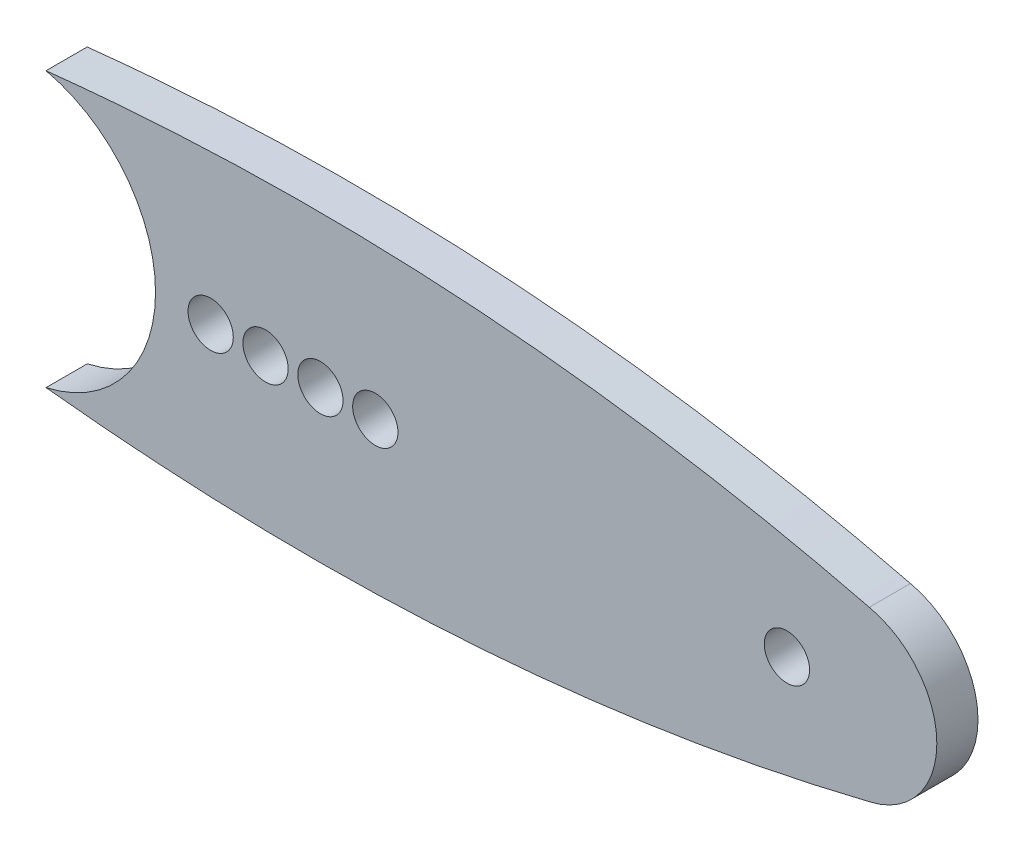
ISO-10303-21;
HEADER;
FILE_DESCRIPTION(('STEP AP214'),'2;1');
FILE_NAME('part.step','',(''),(''),'','','');
FILE_SCHEMA(('AUTOMOTIVE_DESIGN { 1 0 10303 214 1 1 1 1 }'));
ENDSEC;
DATA;
#1=APPLICATION_CONTEXT('core data for automotive mechanical design processes');
#2=APPLICATION_PROTOCOL_DEFINITION('international standard','automotive_design',2000,#1);
#3=PRODUCT_CONTEXT('',#1,'mechanical');
#4=PRODUCT('Part','Part','',(#3));
#5=PRODUCT_RELATED_PRODUCT_CATEGORY('part','',(#4));
#6=PRODUCT_DEFINITION_FORMATION('','',#4);
#7=PRODUCT_DEFINITION_CONTEXT('part definition',#1,'design');
#8=PRODUCT_DEFINITION('design','',#6,#7);
#9=PRODUCT_DEFINITION_SHAPE('','',#8);
#10=(LENGTH_UNIT() NAMED_UNIT(*) SI_UNIT(.MILLI.,.METRE.));
#11=(NAMED_UNIT(*) PLANE_ANGLE_UNIT() SI_UNIT($,.RADIAN.));
#12=(NAMED_UNIT(*) SI_UNIT($,.STERADIAN.) SOLID_ANGLE_UNIT());
#13=UNCERTAINTY_MEASURE_WITH_UNIT(LENGTH_MEASURE(1.E-05),#10,'distance_accuracy_value','');
#14=(GEOMETRIC_REPRESENTATION_CONTEXT(3) GLOBAL_UNCERTAINTY_ASSIGNED_CONTEXT((#13)) GLOBAL_UNIT_ASSIGNED_CONTEXT((#10,
#11,#12)) REPRESENTATION_CONTEXT('',''));
#15=CARTESIAN_POINT('',(0.,0.,0.));
#16=DIRECTION('',(0.,0.,1.));
#17=DIRECTION('',(1.,0.,0.));
#18=AXIS2_PLACEMENT_3D('',#15,#16,#17);
#19=CARTESIAN_POINT('',(30.4462397626462,10.7025311532782,0.));
#20=DIRECTION('',(0.,0.,1.));
#21=DIRECTION('',(1.,0.,0.));
#22=AXIS2_PLACEMENT_3D('',#19,#20,#21);
#23=PLANE('',#22);
#24=CARTESIAN_POINT('',(54.,0.,0.));
#25=DIRECTION('',(0.,0.,1.));
#26=DIRECTION('',(1.,0.,0.));
#27=AXIS2_PLACEMENT_3D('',#24,#25,#26);
#28=CIRCLE('',#27,1.65);
#29=CARTESIAN_POINT('',(55.65,0.,0.));
#30=VERTEX_POINT('',#29);
#31=EDGE_CURVE('E126',#30,#30,#28,.T.);
#32=ORIENTED_EDGE('',*,*,#31,.T.);
#33=EDGE_LOOP('',(#32));
#34=FACE_BOUND('',#33,.T.);
#35=CARTESIAN_POINT('',(24.,0.,0.));
#36=DIRECTION('',(0.,0.,1.));
#37=DIRECTION('',(1.,0.,0.));
#38=AXIS2_PLACEMENT_3D('',#35,#36,#37);
#39=CIRCLE('',#38,1.65);
#40=CARTESIAN_POINT('',(25.65,0.,0.));
#41=VERTEX_POINT('',#40);
#42=EDGE_CURVE('E136',#41,#41,#39,.T.);
#43=ORIENTED_EDGE('',*,*,#42,.T.);
#44=EDGE_LOOP('',(#43));
#45=FACE_BOUND('',#44,.T.);
#46=CARTESIAN_POINT('',(12.,0.,0.));
#47=DIRECTION('',(0.,0.,1.));
#48=DIRECTION('',(1.,0.,0.));
#49=AXIS2_PLACEMENT_3D('',#46,#47,#48);
#50=CIRCLE('',#49,1.65);
#51=CARTESIAN_POINT('',(13.65,0.,0.));
#52=VERTEX_POINT('',#51);
#53=EDGE_CURVE('E141',#52,#52,#50,.T.);
#54=ORIENTED_EDGE('',*,*,#53,.T.);
#55=EDGE_LOOP('',(#54));
#56=FACE_BOUND('',#55,.T.);
#57=CARTESIAN_POINT('',(20.,0.,0.));
#58=DIRECTION('',(0.,0.,1.));
#59=DIRECTION('',(1.,0.,0.));
#60=AXIS2_PLACEMENT_3D('',#57,#58,#59);
#61=CIRCLE('',#60,1.65);
#62=CARTESIAN_POINT('',(21.65,0.,0.));
#63=VERTEX_POINT('',#62);
#64=EDGE_CURVE('E147',#63,#63,#61,.T.);
#65=ORIENTED_EDGE('',*,*,#64,.T.);
#66=EDGE_LOOP('',(#65));
#67=FACE_BOUND('',#66,.T.);
#68=CARTESIAN_POINT('',(16.,0.,0.));
#69=DIRECTION('',(0.,0.,1.));
#70=DIRECTION('',(1.,0.,0.));
#71=AXIS2_PLACEMENT_3D('',#68,#69,#70);
#72=CIRCLE('',#71,1.65);
#73=CARTESIAN_POINT('',(17.65,0.,0.));
#74=VERTEX_POINT('',#73);
#75=EDGE_CURVE('E153',#74,#74,#72,.T.);
#76=ORIENTED_EDGE('',*,*,#75,.T.);
#77=EDGE_LOOP('',(#76));
#78=FACE_BOUND('',#77,.T.);
#79=CARTESIAN_POINT('',(60.,6.13600538206782,0.));
#80=CARTESIAN_POINT('',(30.8924795252925,13.3370596155225,0.));
#81=CARTESIAN_POINT('',(0.,10.,0.));
#82=B_SPLINE_CURVE_WITH_KNOTS('',2,(#79,#80,#81),.UNSPECIFIED.,.F.,.F.,(3,3),(0.,
0.860506177174016),.UNSPECIFIED.);
#83=CARTESIAN_POINT('',(60.,6.13600538206782,0.));
#84=VERTEX_POINT('',#83);
#85=CARTESIAN_POINT('',(0.,10.,0.));
#86=VERTEX_POINT('',#85);
#87=EDGE_CURVE('E159',#84,#86,#82,.T.);
#88=ORIENTED_EDGE('',*,*,#87,.F.);
#89=CARTESIAN_POINT('',(58.6400237608325,0.,0.));
#90=DIRECTION('',(0.,0.,1.));
#91=DIRECTION('',(-1.,0.,0.));
#92=AXIS2_PLACEMENT_3D('',#89,#90,#91);
#93=CIRCLE('',#92,6.28491029529185);
#94=CARTESIAN_POINT('',(60.,-6.13600538206782,0.));
#95=VERTEX_POINT('',#94);
#96=EDGE_CURVE('E168',#95,#84,#93,.T.);
#97=ORIENTED_EDGE('',*,*,#96,.F.);
#98=CARTESIAN_POINT('',(0.,-10.,0.));
#99=CARTESIAN_POINT('',(30.8924795252925,-13.3370596155225,0.));
#100=CARTESIAN_POINT('',(60.,-6.13600538206782,0.));
#101=B_SPLINE_CURVE_WITH_KNOTS('',2,(#98,#99,#100),.UNSPECIFIED.,.F.,.F.,(3,3),(0.,
0.860506177174016),.UNSPECIFIED.);
#102=CARTESIAN_POINT('',(0.,-10.,0.));
#103=VERTEX_POINT('',#102);
#104=EDGE_CURVE('E342',#103,#95,#101,.T.);
#105=ORIENTED_EDGE('',*,*,#104,.F.);
#106=CARTESIAN_POINT('',(-2.2729782475424,0.,0.));
#107=DIRECTION('',(0.,0.,-1.));
#108=DIRECTION('',(-1.,0.,0.));
#109=AXIS2_PLACEMENT_3D('',#106,#107,#108);
#110=CIRCLE('',#109,10.2550685084889);
#111=EDGE_CURVE('E347',#86,#103,#110,.T.);
#112=ORIENTED_EDGE('',*,*,#111,.F.);
#113=EDGE_LOOP('',(#88,#97,#105,#112));
#114=FACE_BOUND('',#113,.T.);
#115=DIRECTION('',(0.,1.,0.));
#116=VECTOR('',#115,1.);
#117=CARTESIAN_POINT('',(29.2337483410634,-1.76319229390439,0.));
#118=LINE('',#117,#116);
#119=CARTESIAN_POINT('',(29.2337483410634,-1.76319229390439,0.));
#120=VERTEX_POINT('',#119);
#121=CARTESIAN_POINT('',(29.2337483410634,1.76319229390438,0.));
#122=VERTEX_POINT('',#121);
#123=EDGE_CURVE('E125',#120,#122,#118,.T.);
#124=ORIENTED_EDGE('',*,*,#123,.F.);
#125=DIRECTION('',(-1.,0.,0.));
#126=VECTOR('',#125,1.);
#127=CARTESIAN_POINT('',(49.2337483410634,-1.76319229390439,0.));
#128=LINE('',#127,#126);
#129=CARTESIAN_POINT('',(49.2337483410634,-1.76319229390439,0.));
#130=VERTEX_POINT('',#129);
#131=EDGE_CURVE('E122',#130,#120,#128,.T.);
#132=ORIENTED_EDGE('',*,*,#131,.F.);
#133=DIRECTION('',(0.,-1.,0.));
#134=VECTOR('',#133,1.);
#135=CARTESIAN_POINT('',(49.2337483410634,-1.76319229390439,0.));
#136=LINE('',#135,#134);
#137=CARTESIAN_POINT('',(49.2337483410634,1.76319229390438,0.));
#138=VERTEX_POINT('',#137);
#139=EDGE_CURVE('E60',#138,#130,#136,.T.);
#140=ORIENTED_EDGE('',*,*,#139,.F.);
#141=DIRECTION('',(1.,0.,0.));
#142=VECTOR('',#141,1.);
#143=CARTESIAN_POINT('',(49.2337483410634,1.76319229390438,0.));
#144=LINE('',#143,#142);
#145=EDGE_CURVE('E55',#122,#138,#144,.T.);
#146=ORIENTED_EDGE('',*,*,#145,.F.);
#147=EDGE_LOOP('',(#124,#132,#140,#146));
#148=FACE_BOUND('',#147,.T.);
#149=ADVANCED_FACE('F39',(#34,#45,#56,#67,#78,#114,#148),#23,.F.);
#150=CARTESIAN_POINT('',(30.4462397626462,10.7025311532782,3.));
#151=DIRECTION('',(0.,0.,1.));
#152=DIRECTION('',(1.,0.,0.));
#153=AXIS2_PLACEMENT_3D('',#150,#151,#152);
#154=PLANE('',#153);
#155=CARTESIAN_POINT('',(24.,0.,3.));
#156=DIRECTION('',(0.,0.,1.));
#157=DIRECTION('',(1.,0.,0.));
#158=AXIS2_PLACEMENT_3D('',#155,#156,#157);
#159=CIRCLE('',#158,1.65);
#160=CARTESIAN_POINT('',(25.65,0.,3.));
#161=VERTEX_POINT('',#160);
#162=EDGE_CURVE('E138',#161,#161,#159,.T.);
#163=ORIENTED_EDGE('',*,*,#162,.F.);
#164=EDGE_LOOP('',(#163));
#165=FACE_BOUND('',#164,.T.);
#166=CARTESIAN_POINT('',(20.,0.,3.));
#167=DIRECTION('',(0.,0.,1.));
#168=DIRECTION('',(1.,0.,0.));
#169=AXIS2_PLACEMENT_3D('',#166,#167,#168);
#170=CIRCLE('',#169,1.65);
#171=CARTESIAN_POINT('',(21.65,0.,3.));
#172=VERTEX_POINT('',#171);
#173=EDGE_CURVE('E150',#172,#172,#170,.T.);
#174=ORIENTED_EDGE('',*,*,#173,.F.);
#175=EDGE_LOOP('',(#174));
#176=FACE_BOUND('',#175,.T.);
#177=CARTESIAN_POINT('',(60.,6.13600538206782,3.));
#178=CARTESIAN_POINT('',(30.8924795252925,13.3370596155225,3.));
#179=CARTESIAN_POINT('',(0.,10.,3.));
#180=B_SPLINE_CURVE_WITH_KNOTS('',2,(#177,#178,#179),.UNSPECIFIED.,.F.,.F.,(3,3),(0.,
0.860506177174016),.UNSPECIFIED.);
#181=CARTESIAN_POINT('',(60.,6.13600538206782,3.));
#182=VERTEX_POINT('',#181);
#183=CARTESIAN_POINT('',(0.,10.,3.));
#184=VERTEX_POINT('',#183);
#185=EDGE_CURVE('E161',#182,#184,#180,.T.);
#186=ORIENTED_EDGE('',*,*,#185,.T.);
#187=CARTESIAN_POINT('',(-2.2729782475424,0.,3.));
#188=DIRECTION('',(0.,0.,-1.));
#189=DIRECTION('',(-1.,0.,0.));
#190=AXIS2_PLACEMENT_3D('',#187,#188,#189);
#191=CIRCLE('',#190,10.2550685084889);
#192=CARTESIAN_POINT('',(0.,-10.,3.));
#193=VERTEX_POINT('',#192);
#194=EDGE_CURVE('E167',#184,#193,#191,.T.);
#195=ORIENTED_EDGE('',*,*,#194,.T.);
#196=CARTESIAN_POINT('',(0.,-10.,3.));
#197=CARTESIAN_POINT('',(30.8924795252925,-13.3370596155225,3.));
#198=CARTESIAN_POINT('',(60.,-6.13600538206782,3.));
#199=B_SPLINE_CURVE_WITH_KNOTS('',2,(#196,#197,#198),.UNSPECIFIED.,.F.,.F.,(3,3),(0.,
0.860506177174016),.UNSPECIFIED.);
#200=CARTESIAN_POINT('',(60.,-6.13600538206782,3.));
#201=VERTEX_POINT('',#200);
#202=EDGE_CURVE('E173',#193,#201,#199,.T.);
#203=ORIENTED_EDGE('',*,*,#202,.T.);
#204=CARTESIAN_POINT('',(58.6400237608325,0.,3.));
#205=DIRECTION('',(0.,0.,1.));
#206=DIRECTION('',(-1.,0.,0.));
#207=AXIS2_PLACEMENT_3D('',#204,#205,#206);
#208=CIRCLE('',#207,6.28491029529185);
#209=EDGE_CURVE('E178',#201,#182,#208,.T.);
#210=ORIENTED_EDGE('',*,*,#209,.T.);
#211=EDGE_LOOP('',(#186,#195,#203,#210));
#212=FACE_BOUND('',#211,.T.);
#213=CARTESIAN_POINT('',(16.,0.,3.));
#214=DIRECTION('',(0.,0.,1.));
#215=DIRECTION('',(1.,0.,0.));
#216=AXIS2_PLACEMENT_3D('',#213,#214,#215);
#217=CIRCLE('',#216,1.65);
#218=CARTESIAN_POINT('',(17.65,0.,3.));
#219=VERTEX_POINT('',#218);
#220=EDGE_CURVE('E156',#219,#219,#217,.T.);
#221=ORIENTED_EDGE('',*,*,#220,.F.);
#222=EDGE_LOOP('',(#221));
#223=FACE_BOUND('',#222,.T.);
#224=CARTESIAN_POINT('',(12.,0.,3.));
#225=DIRECTION('',(0.,0.,1.));
#226=DIRECTION('',(1.,0.,0.));
#227=AXIS2_PLACEMENT_3D('',#224,#225,#226);
#228=CIRCLE('',#227,1.65);
#229=CARTESIAN_POINT('',(13.65,0.,3.));
#230=VERTEX_POINT('',#229);
#231=EDGE_CURVE('E144',#230,#230,#228,.T.);
#232=ORIENTED_EDGE('',*,*,#231,.F.);
#233=EDGE_LOOP('',(#232));
#234=FACE_BOUND('',#233,.T.);
#235=CARTESIAN_POINT('',(54.,0.,3.));
#236=DIRECTION('',(0.,0.,1.));
#237=DIRECTION('',(1.,0.,0.));
#238=AXIS2_PLACEMENT_3D('',#235,#236,#237);
#239=CIRCLE('',#238,1.65);
#240=CARTESIAN_POINT('',(55.65,0.,3.));
#241=VERTEX_POINT('',#240);
#242=EDGE_CURVE('E129',#241,#241,#239,.T.);
#243=ORIENTED_EDGE('',*,*,#242,.F.);
#244=EDGE_LOOP('',(#243));
#245=FACE_BOUND('',#244,.T.);
#246=ADVANCED_FACE('F196',(#165,#176,#212,#223,#234,#245),#154,.T.);
#247=DIRECTION('',(0.,0.,-1.));
#248=VECTOR('',#247,1.);
#249=SURFACE_OF_LINEAR_EXTRUSION('',#180,#248);
#250=ORIENTED_EDGE('',*,*,#87,.T.);
#251=DIRECTION('',(0.,0.,-1.));
#252=VECTOR('',#251,1.);
#253=CARTESIAN_POINT('',(0.,10.,3.));
#254=LINE('',#253,#252);
#255=EDGE_CURVE('E11',#184,#86,#254,.T.);
#256=ORIENTED_EDGE('',*,*,#255,.F.);
#257=ORIENTED_EDGE('',*,*,#185,.F.);
#258=DIRECTION('',(0.,0.,-1.));
#259=VECTOR('',#258,1.);
#260=CARTESIAN_POINT('',(60.,6.13600538206782,3.));
#261=LINE('',#260,#259);
#262=EDGE_CURVE('E335',#182,#84,#261,.T.);
#263=ORIENTED_EDGE('',*,*,#262,.T.);
#264=EDGE_LOOP('',(#250,#256,#257,#263));
#265=FACE_BOUND('',#264,.T.);
#266=ADVANCED_FACE('F41',(#265),#249,.F.);
#267=CARTESIAN_POINT('',(-2.2729782475424,0.,3.));
#268=DIRECTION('',(0.,0.,-1.));
#269=DIRECTION('',(-1.,0.,0.));
#270=AXIS2_PLACEMENT_3D('',#267,#268,#269);
#271=CYLINDRICAL_SURFACE('',#270,10.2550685084889);
#272=ORIENTED_EDGE('',*,*,#111,.T.);
#273=DIRECTION('',(0.,0.,-1.));
#274=VECTOR('',#273,1.);
#275=CARTESIAN_POINT('',(0.,-10.,3.));
#276=LINE('',#275,#274);
#277=EDGE_CURVE('E48',#193,#103,#276,.T.);
#278=ORIENTED_EDGE('',*,*,#277,.F.);
#279=ORIENTED_EDGE('',*,*,#194,.F.);
#280=ORIENTED_EDGE('',*,*,#255,.T.);
#281=EDGE_LOOP('',(#272,#278,#279,#280));
#282=FACE_BOUND('',#281,.T.);
#283=ADVANCED_FACE('F188',(#282),#271,.F.);
#284=DIRECTION('',(0.,0.,-1.));
#285=VECTOR('',#284,1.);
#286=SURFACE_OF_LINEAR_EXTRUSION('',#199,#285);
#287=ORIENTED_EDGE('',*,*,#104,.T.);
#288=DIRECTION('',(0.,0.,-1.));
#289=VECTOR('',#288,1.);
#290=CARTESIAN_POINT('',(60.,-6.13600538206782,3.));
#291=LINE('',#290,#289);
#292=EDGE_CURVE('E338',#201,#95,#291,.T.);
#293=ORIENTED_EDGE('',*,*,#292,.F.);
#294=ORIENTED_EDGE('',*,*,#202,.F.);
#295=ORIENTED_EDGE('',*,*,#277,.T.);
#296=EDGE_LOOP('',(#287,#293,#294,#295));
#297=FACE_BOUND('',#296,.T.);
#298=ADVANCED_FACE('F184',(#297),#286,.F.);
#299=CARTESIAN_POINT('',(58.6400237608325,0.,3.));
#300=DIRECTION('',(0.,0.,-1.));
#301=DIRECTION('',(-1.,0.,0.));
#302=AXIS2_PLACEMENT_3D('',#299,#300,#301);
#303=CYLINDRICAL_SURFACE('',#302,6.28491029529185);
#304=ORIENTED_EDGE('',*,*,#96,.T.);
#305=ORIENTED_EDGE('',*,*,#262,.F.);
#306=ORIENTED_EDGE('',*,*,#209,.F.);
#307=ORIENTED_EDGE('',*,*,#292,.T.);
#308=EDGE_LOOP('',(#304,#305,#306,#307));
#309=FACE_BOUND('',#308,.T.);
#310=ADVANCED_FACE('F187',(#309),#303,.T.);
#311=CARTESIAN_POINT('',(16.,0.,3.));
#312=DIRECTION('',(0.,0.,-1.));
#313=DIRECTION('',(-1.,0.,0.));
#314=AXIS2_PLACEMENT_3D('',#311,#312,#313);
#315=CYLINDRICAL_SURFACE('',#314,1.65);
#316=ORIENTED_EDGE('',*,*,#220,.T.);
#317=EDGE_LOOP('',(#316));
#318=FACE_BOUND('',#317,.T.);
#319=ORIENTED_EDGE('',*,*,#75,.F.);
#320=EDGE_LOOP('',(#319));
#321=FACE_BOUND('',#320,.T.);
#322=ADVANCED_FACE('F209',(#318,#321),#315,.F.);
#323=CARTESIAN_POINT('',(20.,0.,3.));
#324=DIRECTION('',(0.,0.,-1.));
#325=DIRECTION('',(-1.,0.,0.));
#326=AXIS2_PLACEMENT_3D('',#323,#324,#325);
#327=CYLINDRICAL_SURFACE('',#326,1.65);
#328=ORIENTED_EDGE('',*,*,#173,.T.);
#329=EDGE_LOOP('',(#328));
#330=FACE_BOUND('',#329,.T.);
#331=ORIENTED_EDGE('',*,*,#64,.F.);
#332=EDGE_LOOP('',(#331));
#333=FACE_BOUND('',#332,.T.);
#334=ADVANCED_FACE('F212',(#330,#333),#327,.F.);
#335=CARTESIAN_POINT('',(12.,0.,3.));
#336=DIRECTION('',(0.,0.,-1.));
#337=DIRECTION('',(-1.,0.,0.));
#338=AXIS2_PLACEMENT_3D('',#335,#336,#337);
#339=CYLINDRICAL_SURFACE('',#338,1.65);
#340=ORIENTED_EDGE('',*,*,#231,.T.);
#341=EDGE_LOOP('',(#340));
#342=FACE_BOUND('',#341,.T.);
#343=ORIENTED_EDGE('',*,*,#53,.F.);
#344=EDGE_LOOP('',(#343));
#345=FACE_BOUND('',#344,.T.);
#346=ADVANCED_FACE('F216',(#342,#345),#339,.F.);
#347=CARTESIAN_POINT('',(24.,0.,3.));
#348=DIRECTION('',(0.,0.,-1.));
#349=DIRECTION('',(-1.,0.,0.));
#350=AXIS2_PLACEMENT_3D('',#347,#348,#349);
#351=CYLINDRICAL_SURFACE('',#350,1.65);
#352=ORIENTED_EDGE('',*,*,#162,.T.);
#353=EDGE_LOOP('',(#352));
#354=FACE_BOUND('',#353,.T.);
#355=ORIENTED_EDGE('',*,*,#42,.F.);
#356=EDGE_LOOP('',(#355));
#357=FACE_BOUND('',#356,.T.);
#358=ADVANCED_FACE('F220',(#354,#357),#351,.F.);
#359=CARTESIAN_POINT('',(54.,0.,3.));
#360=DIRECTION('',(0.,0.,-1.));
#361=DIRECTION('',(-1.,0.,0.));
#362=AXIS2_PLACEMENT_3D('',#359,#360,#361);
#363=CYLINDRICAL_SURFACE('',#362,1.65);
#364=ORIENTED_EDGE('',*,*,#242,.T.);
#365=EDGE_LOOP('',(#364));
#366=FACE_BOUND('',#365,.T.);
#367=ORIENTED_EDGE('',*,*,#31,.F.);
#368=EDGE_LOOP('',(#367));
#369=FACE_BOUND('',#368,.T.);
#370=ADVANCED_FACE('F224',(#366,#369),#363,.F.);
#371=CARTESIAN_POINT('',(29.2337483410634,-1.76319229390439,-3.));
#372=DIRECTION('',(1.,0.,0.));
#373=DIRECTION('',(0.,0.,-1.));
#374=AXIS2_PLACEMENT_3D('',#371,#372,#373);
#375=PLANE('',#374);
#376=ORIENTED_EDGE('',*,*,#123,.T.);
#377=DIRECTION('',(0.,0.,1.));
#378=VECTOR('',#377,1.);
#379=CARTESIAN_POINT('',(29.2337483410634,1.76319229390438,-3.));
#380=LINE('',#379,#378);
#381=CARTESIAN_POINT('',(29.2337483410634,1.76319229390438,-3.));
#382=VERTEX_POINT('',#381);
#383=EDGE_CURVE('E106',#382,#122,#380,.T.);
#384=ORIENTED_EDGE('',*,*,#383,.F.);
#385=DIRECTION('',(0.,1.,0.));
#386=VECTOR('',#385,1.);
#387=CARTESIAN_POINT('',(29.2337483410634,-1.76319229390439,-3.));
#388=LINE('',#387,#386);
#389=CARTESIAN_POINT('',(29.2337483410634,-1.76319229390439,-3.));
#390=VERTEX_POINT('',#389);
#391=EDGE_CURVE('E113',#390,#382,#388,.T.);
#392=ORIENTED_EDGE('',*,*,#391,.F.);
#393=DIRECTION('',(0.,0.,1.));
#394=VECTOR('',#393,1.);
#395=CARTESIAN_POINT('',(29.2337483410634,-1.76319229390439,-3.));
#396=LINE('',#395,#394);
#397=EDGE_CURVE('E385',#390,#120,#396,.T.);
#398=ORIENTED_EDGE('',*,*,#397,.T.);
#399=EDGE_LOOP('',(#376,#384,#392,#398));
#400=FACE_BOUND('',#399,.T.);
#401=ADVANCED_FACE('F124',(#400),#375,.F.);
#402=CARTESIAN_POINT('',(49.2337483410634,1.76319229390438,-3.));
#403=DIRECTION('',(0.,-1.,0.));
#404=DIRECTION('',(0.,0.,-1.));
#405=AXIS2_PLACEMENT_3D('',#402,#403,#404);
#406=PLANE('',#405);
#407=ORIENTED_EDGE('',*,*,#145,.T.);
#408=DIRECTION('',(0.,0.,1.));
#409=VECTOR('',#408,1.);
#410=CARTESIAN_POINT('',(49.2337483410634,1.76319229390438,-3.));
#411=LINE('',#410,#409);
#412=CARTESIAN_POINT('',(49.2337483410634,1.76319229390438,-3.));
#413=VERTEX_POINT('',#412);
#414=EDGE_CURVE('E109',#413,#138,#411,.T.);
#415=ORIENTED_EDGE('',*,*,#414,.F.);
#416=DIRECTION('',(1.,0.,0.));
#417=VECTOR('',#416,1.);
#418=CARTESIAN_POINT('',(49.2337483410634,1.76319229390438,-3.));
#419=LINE('',#418,#417);
#420=EDGE_CURVE('E102',#382,#413,#419,.T.);
#421=ORIENTED_EDGE('',*,*,#420,.F.);
#422=ORIENTED_EDGE('',*,*,#383,.T.);
#423=EDGE_LOOP('',(#407,#415,#421,#422));
#424=FACE_BOUND('',#423,.T.);
#425=ADVANCED_FACE('F104',(#424),#406,.F.);
#426=CARTESIAN_POINT('',(49.2337483410634,-1.76319229390439,-3.));
#427=DIRECTION('',(-1.,0.,0.));
#428=DIRECTION('',(0.,0.,1.));
#429=AXIS2_PLACEMENT_3D('',#426,#427,#428);
#430=PLANE('',#429);
#431=ORIENTED_EDGE('',*,*,#139,.T.);
#432=DIRECTION('',(0.,0.,1.));
#433=VECTOR('',#432,1.);
#434=CARTESIAN_POINT('',(49.2337483410634,-1.76319229390439,-3.));
#435=LINE('',#434,#433);
#436=CARTESIAN_POINT('',(49.2337483410634,-1.76319229390439,-3.));
#437=VERTEX_POINT('',#436);
#438=EDGE_CURVE('E131',#437,#130,#435,.T.);
#439=ORIENTED_EDGE('',*,*,#438,.F.);
#440=DIRECTION('',(0.,-1.,0.));
#441=VECTOR('',#440,1.);
#442=CARTESIAN_POINT('',(49.2337483410634,-1.76319229390439,-3.));
#443=LINE('',#442,#441);
#444=EDGE_CURVE('E112',#413,#437,#443,.T.);
#445=ORIENTED_EDGE('',*,*,#444,.F.);
#446=ORIENTED_EDGE('',*,*,#414,.T.);
#447=EDGE_LOOP('',(#431,#439,#445,#446));
#448=FACE_BOUND('',#447,.T.);
#449=ADVANCED_FACE('F231',(#448),#430,.F.);
#450=CARTESIAN_POINT('',(49.2337483410634,-1.76319229390439,-3.));
#451=DIRECTION('',(0.,1.,0.));
#452=DIRECTION('',(0.,0.,1.));
#453=AXIS2_PLACEMENT_3D('',#450,#451,#452);
#454=PLANE('',#453);
#455=ORIENTED_EDGE('',*,*,#131,.T.);
#456=ORIENTED_EDGE('',*,*,#397,.F.);
#457=DIRECTION('',(-1.,0.,0.));
#458=VECTOR('',#457,1.);
#459=CARTESIAN_POINT('',(49.2337483410634,-1.76319229390439,-3.));
#460=LINE('',#459,#458);
#461=EDGE_CURVE('E118',#437,#390,#460,.T.);
#462=ORIENTED_EDGE('',*,*,#461,.F.);
#463=ORIENTED_EDGE('',*,*,#438,.T.);
#464=EDGE_LOOP('',(#455,#456,#462,#463));
#465=FACE_BOUND('',#464,.T.);
#466=ADVANCED_FACE('F234',(#465),#454,.F.);
#467=CARTESIAN_POINT('',(0.,0.,-3.));
#468=DIRECTION('',(0.,0.,1.));
#469=DIRECTION('',(1.,0.,0.));
#470=AXIS2_PLACEMENT_3D('',#467,#468,#469);
#471=PLANE('',#470);
#472=ORIENTED_EDGE('',*,*,#391,.T.);
#473=ORIENTED_EDGE('',*,*,#420,.T.);
#474=ORIENTED_EDGE('',*,*,#444,.T.);
#475=ORIENTED_EDGE('',*,*,#461,.T.);
#476=EDGE_LOOP('',(#472,#473,#474,#475));
#477=FACE_BOUND('',#476,.T.);
#478=ADVANCED_FACE('F116',(#477),#471,.F.);
#479=CLOSED_SHELL('',(#149,#246,#266,#283,#298,#310,#322,#334,#346,#358,#370,#401,#425,#449,
#466,#478));
#480=MANIFOLD_SOLID_BREP('B2',#479);
#481=ADVANCED_BREP_SHAPE_REPRESENTATION('',(#18,#480),#14);
#482=SHAPE_DEFINITION_REPRESENTATION(#9,#481);
ENDSEC;
END-ISO-10303-21;
